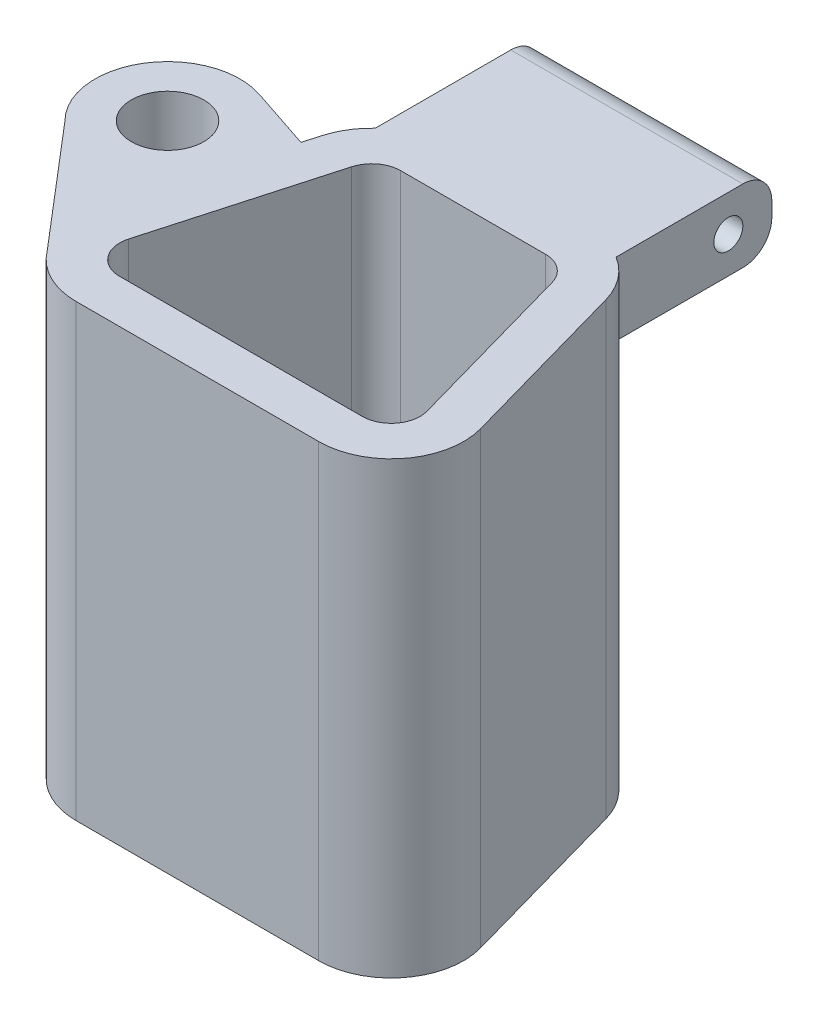
ISO-10303-21;
HEADER;
FILE_DESCRIPTION(('STEP AP214'),'2;1');
FILE_NAME('part.step','',(''),(''),'','','');
FILE_SCHEMA(('AUTOMOTIVE_DESIGN { 1 0 10303 214 1 1 1 1 }'));
ENDSEC;
DATA;
#1=APPLICATION_CONTEXT('core data for automotive mechanical design processes');
#2=APPLICATION_PROTOCOL_DEFINITION('international standard','automotive_design',2000,#1);
#3=PRODUCT_CONTEXT('',#1,'mechanical');
#4=PRODUCT('Part','Part','',(#3));
#5=PRODUCT_RELATED_PRODUCT_CATEGORY('part','',(#4));
#6=PRODUCT_DEFINITION_FORMATION('','',#4);
#7=PRODUCT_DEFINITION_CONTEXT('part definition',#1,'design');
#8=PRODUCT_DEFINITION('design','',#6,#7);
#9=PRODUCT_DEFINITION_SHAPE('','',#8);
#10=(LENGTH_UNIT() NAMED_UNIT(*) SI_UNIT(.MILLI.,.METRE.));
#11=(NAMED_UNIT(*) PLANE_ANGLE_UNIT() SI_UNIT($,.RADIAN.));
#12=(NAMED_UNIT(*) SI_UNIT($,.STERADIAN.) SOLID_ANGLE_UNIT());
#13=UNCERTAINTY_MEASURE_WITH_UNIT(LENGTH_MEASURE(1.E-05),#10,'distance_accuracy_value','');
#14=(GEOMETRIC_REPRESENTATION_CONTEXT(3) GLOBAL_UNCERTAINTY_ASSIGNED_CONTEXT((#13)) GLOBAL_UNIT_ASSIGNED_CONTEXT((#10,
#11,#12)) REPRESENTATION_CONTEXT('',''));
#15=CARTESIAN_POINT('',(0.,0.,0.));
#16=DIRECTION('',(0.,0.,1.));
#17=DIRECTION('',(1.,0.,0.));
#18=AXIS2_PLACEMENT_3D('',#15,#16,#17);
#19=CARTESIAN_POINT('',(0.,0.,-21.));
#20=DIRECTION('',(0.,0.,1.));
#21=DIRECTION('',(1.,0.,0.));
#22=AXIS2_PLACEMENT_3D('',#19,#20,#21);
#23=PLANE('',#22);
#24=DIRECTION('',(1.,0.,0.));
#25=VECTOR('',#24,1.);
#26=CARTESIAN_POINT('',(0.,28.,-21.));
#27=LINE('',#26,#25);
#28=CARTESIAN_POINT('',(-8.39857367676646,28.,-21.));
#29=VERTEX_POINT('',#28);
#30=CARTESIAN_POINT('',(7.60142632323355,28.,-21.));
#31=VERTEX_POINT('',#30);
#32=EDGE_CURVE('E357',#29,#31,#27,.T.);
#33=ORIENTED_EDGE('',*,*,#32,.F.);
#34=DIRECTION('',(0.,1.,0.));
#35=VECTOR('',#34,1.);
#36=CARTESIAN_POINT('',(-8.39857367676646,26.,-21.));
#37=LINE('',#36,#35);
#38=CARTESIAN_POINT('',(-8.39857367676646,29.,-21.));
#39=VERTEX_POINT('',#38);
#40=EDGE_CURVE('E328',#39,#29,#37,.F.);
#41=ORIENTED_EDGE('',*,*,#40,.F.);
#42=DIRECTION('',(1.,0.,0.));
#43=VECTOR('',#42,1.);
#44=CARTESIAN_POINT('',(0.,29.,-21.));
#45=LINE('',#44,#43);
#46=CARTESIAN_POINT('',(7.60142632323355,29.,-21.));
#47=VERTEX_POINT('',#46);
#48=EDGE_CURVE('E319',#47,#39,#45,.F.);
#49=ORIENTED_EDGE('',*,*,#48,.F.);
#50=DIRECTION('',(0.,1.,0.));
#51=VECTOR('',#50,1.);
#52=CARTESIAN_POINT('',(7.60142632323355,0.,-21.));
#53=LINE('',#52,#51);
#54=EDGE_CURVE('E361',#31,#47,#53,.T.);
#55=ORIENTED_EDGE('',*,*,#54,.F.);
#56=EDGE_LOOP('',(#33,#41,#49,#55));
#57=FACE_BOUND('',#56,.T.);
#58=ADVANCED_FACE('F17',(#57),#23,.F.);
#59=CARTESIAN_POINT('',(13.3599037326757,28.5,-18.));
#60=DIRECTION('',(-1.,0.,0.));
#61=DIRECTION('',(0.,0.,1.));
#62=AXIS2_PLACEMENT_3D('',#59,#60,#61);
#63=CYLINDRICAL_SURFACE('',#62,1.);
#64=CARTESIAN_POINT('',(7.60142632323355,28.5,-18.));
#65=DIRECTION('',(-1.,0.,0.));
#66=DIRECTION('',(0.,0.,1.));
#67=AXIS2_PLACEMENT_3D('',#64,#65,#66);
#68=CIRCLE('',#67,1.);
#69=CARTESIAN_POINT('',(7.60142632323355,28.5,-17.));
#70=VERTEX_POINT('',#69);
#71=EDGE_CURVE('E316',#70,#70,#68,.T.);
#72=ORIENTED_EDGE('',*,*,#71,.F.);
#73=EDGE_LOOP('',(#72));
#74=FACE_BOUND('',#73,.T.);
#75=CARTESIAN_POINT('',(-8.39857367676645,28.5,-18.));
#76=DIRECTION('',(-1.,0.,0.));
#77=DIRECTION('',(0.,0.,1.));
#78=AXIS2_PLACEMENT_3D('',#75,#76,#77);
#79=CIRCLE('',#78,1.);
#80=CARTESIAN_POINT('',(-8.39857367676645,28.5,-17.));
#81=VERTEX_POINT('',#80);
#82=EDGE_CURVE('E329',#81,#81,#79,.F.);
#83=ORIENTED_EDGE('',*,*,#82,.F.);
#84=EDGE_LOOP('',(#83));
#85=FACE_BOUND('',#84,.T.);
#86=ADVANCED_FACE('F570',(#74,#85),#63,.F.);
#87=CARTESIAN_POINT('',(0.,28.,-19.));
#88=DIRECTION('',(1.,0.,0.));
#89=DIRECTION('',(0.,0.,-1.));
#90=AXIS2_PLACEMENT_3D('',#87,#88,#89);
#91=CYLINDRICAL_SURFACE('',#90,2.);
#92=CARTESIAN_POINT('',(-8.39857367676646,28.,-19.));
#93=DIRECTION('',(1.,0.,0.));
#94=DIRECTION('',(0.,0.,-1.));
#95=AXIS2_PLACEMENT_3D('',#92,#93,#94);
#96=CIRCLE('',#95,2.);
#97=CARTESIAN_POINT('',(-8.39857367676646,26.,-19.));
#98=VERTEX_POINT('',#97);
#99=EDGE_CURVE('E324',#29,#98,#96,.F.);
#100=ORIENTED_EDGE('',*,*,#99,.F.);
#101=ORIENTED_EDGE('',*,*,#32,.T.);
#102=CARTESIAN_POINT('',(7.60142632323355,28.,-19.));
#103=DIRECTION('',(1.,0.,0.));
#104=DIRECTION('',(0.,0.,-1.));
#105=AXIS2_PLACEMENT_3D('',#102,#103,#104);
#106=CIRCLE('',#105,2.);
#107=CARTESIAN_POINT('',(7.60142632323355,26.,-19.));
#108=VERTEX_POINT('',#107);
#109=EDGE_CURVE('E312',#108,#31,#106,.T.);
#110=ORIENTED_EDGE('',*,*,#109,.F.);
#111=DIRECTION('',(1.,0.,0.));
#112=VECTOR('',#111,1.);
#113=CARTESIAN_POINT('',(7.60142632323355,26.,-19.));
#114=LINE('',#113,#112);
#115=EDGE_CURVE('E360',#98,#108,#114,.T.);
#116=ORIENTED_EDGE('',*,*,#115,.F.);
#117=EDGE_LOOP('',(#100,#101,#110,#116));
#118=FACE_BOUND('',#117,.T.);
#119=ADVANCED_FACE('F568',(#118),#91,.T.);
#120=CARTESIAN_POINT('',(7.60142632323355,26.,8.76305461424021));
#121=DIRECTION('',(0.,-1.,0.));
#122=DIRECTION('',(0.,0.,-1.));
#123=AXIS2_PLACEMENT_3D('',#120,#121,#122);
#124=PLANE('',#123);
#125=DIRECTION('',(1.,0.,0.));
#126=VECTOR('',#125,1.);
#127=CARTESIAN_POINT('',(-4.98490373267567,26.,-11.));
#128=LINE('',#127,#126);
#129=CARTESIAN_POINT('',(4.98490373267567,26.,-11.));
#130=VERTEX_POINT('',#129);
#131=CARTESIAN_POINT('',(-4.98490373267567,26.,-11.));
#132=VERTEX_POINT('',#131);
#133=EDGE_CURVE('E340',#130,#132,#128,.F.);
#134=ORIENTED_EDGE('',*,*,#133,.T.);
#135=CARTESIAN_POINT('',(-4.98490373267567,26.,-6.));
#136=DIRECTION('',(0.,-1.,0.));
#137=DIRECTION('',(0.,0.,-1.));
#138=AXIS2_PLACEMENT_3D('',#135,#136,#137);
#139=CIRCLE('',#138,5.);
#140=CARTESIAN_POINT('',(-8.39857367676646,26.,-9.65333512188674));
#141=VERTEX_POINT('',#140);
#142=EDGE_CURVE('E333',#141,#132,#139,.T.);
#143=ORIENTED_EDGE('',*,*,#142,.F.);
#144=DIRECTION('',(0.,0.,1.));
#145=VECTOR('',#144,1.);
#146=CARTESIAN_POINT('',(-8.39857367676646,26.,8.76305461424021));
#147=LINE('',#146,#145);
#148=EDGE_CURVE('E327',#98,#141,#147,.T.);
#149=ORIENTED_EDGE('',*,*,#148,.F.);
#150=ORIENTED_EDGE('',*,*,#115,.T.);
#151=DIRECTION('',(0.,0.,-1.));
#152=VECTOR('',#151,1.);
#153=CARTESIAN_POINT('',(7.60142632323355,26.,8.76305461424021));
#154=LINE('',#153,#152);
#155=CARTESIAN_POINT('',(7.60142632323355,26.,-10.260728756105));
#156=VERTEX_POINT('',#155);
#157=EDGE_CURVE('E315',#156,#108,#154,.T.);
#158=ORIENTED_EDGE('',*,*,#157,.F.);
#159=CARTESIAN_POINT('',(4.98490373267567,26.,-6.));
#160=DIRECTION('',(0.,-1.,0.));
#161=DIRECTION('',(0.,0.,-1.));
#162=AXIS2_PLACEMENT_3D('',#159,#160,#161);
#163=CIRCLE('',#162,5.);
#164=EDGE_CURVE('E305',#130,#156,#163,.T.);
#165=ORIENTED_EDGE('',*,*,#164,.F.);
#166=EDGE_LOOP('',(#134,#143,#149,#150,#158,#165));
#167=FACE_BOUND('',#166,.T.);
#168=ADVANCED_FACE('F566',(#167),#124,.T.);
#169=CARTESIAN_POINT('',(-9.79815843344516,31.,-7.35372788459142));
#170=DIRECTION('',(0.962650940153899,0.,0.270745576918284));
#171=DIRECTION('',(0.270745576918284,0.,-0.962650940153899));
#172=AXIS2_PLACEMENT_3D('',#169,#170,#171);
#173=PLANE('',#172);
#174=DIRECTION('',(0.,1.,0.));
#175=VECTOR('',#174,1.);
#176=CARTESIAN_POINT('',(-10.1091899581308,0.,-6.2478380190423));
#177=LINE('',#176,#175);
#178=CARTESIAN_POINT('',(-10.1091899581308,31.,-6.2478380190423));
#179=VERTEX_POINT('',#178);
#180=CARTESIAN_POINT('',(-10.1091899581308,0.,-6.2478380190423));
#181=VERTEX_POINT('',#180);
#182=EDGE_CURVE('E407',#179,#181,#177,.F.);
#183=ORIENTED_EDGE('',*,*,#182,.F.);
#184=DIRECTION('',(0.270745576918284,0.,-0.962650940153899));
#185=VECTOR('',#184,1.);
#186=CARTESIAN_POINT('',(-9.79815843344516,31.,-7.35372788459142));
#187=LINE('',#186,#185);
#188=CARTESIAN_POINT('',(-9.79815843344516,31.,-7.35372788459142));
#189=VERTEX_POINT('',#188);
#190=EDGE_CURVE('E362',#189,#179,#187,.F.);
#191=ORIENTED_EDGE('',*,*,#190,.F.);
#192=DIRECTION('',(0.,-1.,0.));
#193=VECTOR('',#192,1.);
#194=CARTESIAN_POINT('',(-9.79815843344516,31.,-7.35372788459142));
#195=LINE('',#194,#193);
#196=CARTESIAN_POINT('',(-9.79815843344516,0.,-7.35372788459142));
#197=VERTEX_POINT('',#196);
#198=EDGE_CURVE('E332',#197,#189,#195,.F.);
#199=ORIENTED_EDGE('',*,*,#198,.F.);
#200=DIRECTION('',(0.270745576918284,0.,-0.962650940153899));
#201=VECTOR('',#200,1.);
#202=CARTESIAN_POINT('',(-9.79815843344516,0.,-7.35372788459142));
#203=LINE('',#202,#201);
#204=EDGE_CURVE('E420',#181,#197,#203,.T.);
#205=ORIENTED_EDGE('',*,*,#204,.F.);
#206=EDGE_LOOP('',(#183,#191,#199,#205));
#207=FACE_BOUND('',#206,.T.);
#208=ADVANCED_FACE('F538',(#207),#173,.F.);
#209=CARTESIAN_POINT('',(-34.4188702996613,6.75,6.53338760482129));
#210=DIRECTION('',(0.,-1.,0.));
#211=DIRECTION('',(0.,0.,-1.));
#212=AXIS2_PLACEMENT_3D('',#209,#210,#211);
#213=PLANE('',#212);
#214=CARTESIAN_POINT('',(-16.,6.75,-2.93894053226755));
#215=DIRECTION('',(0.,1.,0.));
#216=DIRECTION('',(0.,0.,1.));
#217=AXIS2_PLACEMENT_3D('',#214,#215,#216);
#218=CIRCLE('',#217,2.5);
#219=CARTESIAN_POINT('',(-16.,6.75,-0.438940532267547));
#220=VERTEX_POINT('',#219);
#221=EDGE_CURVE('E337',#220,#220,#218,.F.);
#222=ORIENTED_EDGE('',*,*,#221,.T.);
#223=EDGE_LOOP('',(#222));
#224=FACE_BOUND('',#223,.T.);
#225=DIRECTION('',(0.649266068214155,0.,0.760561353649876));
#226=VECTOR('',#225,1.);
#227=CARTESIAN_POINT('',(-19.5355339059327,6.75,0.596593373665191));
#228=LINE('',#227,#226);
#229=CARTESIAN_POINT('',(-14.4379912957076,6.75,6.5679417895537));
#230=VERTEX_POINT('',#229);
#231=CARTESIAN_POINT('',(-19.5355339059327,6.75,0.59659337366519));
#232=VERTEX_POINT('',#231);
#233=EDGE_CURVE('E410',#230,#232,#228,.F.);
#234=ORIENTED_EDGE('',*,*,#233,.F.);
#235=DIRECTION('',(0.315824000920269,0.,-0.948817790960263));
#236=VECTOR('',#235,1.);
#237=CARTESIAN_POINT('',(-16.4206255796037,6.75,12.5242930359661));
#238=LINE('',#237,#236);
#239=CARTESIAN_POINT('',(-10.1658465901712,6.75,-6.26669677609779));
#240=VERTEX_POINT('',#239);
#241=EDGE_CURVE('E197',#230,#240,#238,.T.);
#242=ORIENTED_EDGE('',*,*,#241,.T.);
#243=DIRECTION('',(-0.948817790960263,0.,-0.315824000920269));
#244=VECTOR('',#243,1.);
#245=CARTESIAN_POINT('',(-14.4208799953987,6.75,-7.68302948706886));
#246=LINE('',#245,#244);
#247=CARTESIAN_POINT('',(-14.4208799953987,6.75,-7.68302948706886));
#248=VERTEX_POINT('',#247);
#249=EDGE_CURVE('E406',#248,#240,#246,.F.);
#250=ORIENTED_EDGE('',*,*,#249,.F.);
#251=CARTESIAN_POINT('',(-16.,6.75,-2.93894053226755));
#252=DIRECTION('',(0.,1.,0.));
#253=DIRECTION('',(0.,0.,1.));
#254=AXIS2_PLACEMENT_3D('',#251,#252,#253);
#255=CIRCLE('',#254,5.);
#256=EDGE_CURVE('E20',#232,#248,#255,.F.);
#257=ORIENTED_EDGE('',*,*,#256,.F.);
#258=EDGE_LOOP('',(#234,#242,#250,#257));
#259=FACE_BOUND('',#258,.T.);
#260=ADVANCED_FACE('F463',(#224,#259),#213,.F.);
#261=CARTESIAN_POINT('',(-16.4206255796037,6.75,12.5242930359661));
#262=DIRECTION('',(0.948817790960263,0.,0.315824000920269));
#263=DIRECTION('',(0.315824000920269,0.,-0.948817790960263));
#264=AXIS2_PLACEMENT_3D('',#261,#262,#263);
#265=PLANE('',#264);
#266=DIRECTION('',(0.315824000920269,0.,-0.948817790960263));
#267=VECTOR('',#266,1.);
#268=CARTESIAN_POINT('',(-14.4379912957076,24.25,6.5679417895537));
#269=LINE('',#268,#267);
#270=CARTESIAN_POINT('',(-14.4379912957076,24.25,6.5679417895537));
#271=VERTEX_POINT('',#270);
#272=CARTESIAN_POINT('',(-10.1658465901712,24.25,-6.26669677609779));
#273=VERTEX_POINT('',#272);
#274=EDGE_CURVE('E350',#271,#273,#269,.T.);
#275=ORIENTED_EDGE('',*,*,#274,.T.);
#276=DIRECTION('',(0.,1.,0.));
#277=VECTOR('',#276,1.);
#278=CARTESIAN_POINT('',(-10.1658465901712,0.,-6.26669677609779));
#279=LINE('',#278,#277);
#280=EDGE_CURVE('E299',#240,#273,#279,.T.);
#281=ORIENTED_EDGE('',*,*,#280,.F.);
#282=ORIENTED_EDGE('',*,*,#241,.F.);
#283=DIRECTION('',(0.,1.,0.));
#284=VECTOR('',#283,1.);
#285=CARTESIAN_POINT('',(-14.4379912957076,0.,6.5679417895537));
#286=LINE('',#285,#284);
#287=EDGE_CURVE('E442',#271,#230,#286,.F.);
#288=ORIENTED_EDGE('',*,*,#287,.F.);
#289=EDGE_LOOP('',(#275,#281,#282,#288));
#290=FACE_BOUND('',#289,.T.);
#291=ADVANCED_FACE('F453',(#290),#265,.F.);
#292=CARTESIAN_POINT('',(-34.4188702996613,24.25,6.53338760482129));
#293=DIRECTION('',(0.,1.,0.));
#294=DIRECTION('',(0.,0.,1.));
#295=AXIS2_PLACEMENT_3D('',#292,#293,#294);
#296=PLANE('',#295);
#297=CARTESIAN_POINT('',(-16.,24.25,-2.93894053226755));
#298=DIRECTION('',(0.,1.,0.));
#299=DIRECTION('',(0.,0.,1.));
#300=AXIS2_PLACEMENT_3D('',#297,#298,#299);
#301=CIRCLE('',#300,2.5);
#302=CARTESIAN_POINT('',(-16.,24.25,-0.438940532267547));
#303=VERTEX_POINT('',#302);
#304=EDGE_CURVE('E296',#303,#303,#301,.T.);
#305=ORIENTED_EDGE('',*,*,#304,.T.);
#306=EDGE_LOOP('',(#305));
#307=FACE_BOUND('',#306,.T.);
#308=DIRECTION('',(-0.948817790960263,0.,-0.315824000920269));
#309=VECTOR('',#308,1.);
#310=CARTESIAN_POINT('',(-14.4208799953987,24.25,-7.68302948706886));
#311=LINE('',#310,#309);
#312=CARTESIAN_POINT('',(-14.4208799953987,24.25,-7.68302948706886));
#313=VERTEX_POINT('',#312);
#314=EDGE_CURVE('E429',#273,#313,#311,.T.);
#315=ORIENTED_EDGE('',*,*,#314,.F.);
#316=ORIENTED_EDGE('',*,*,#274,.F.);
#317=DIRECTION('',(0.649266068214155,0.,0.760561353649876));
#318=VECTOR('',#317,1.);
#319=CARTESIAN_POINT('',(-19.5355339059327,24.25,0.596593373665191));
#320=LINE('',#319,#318);
#321=CARTESIAN_POINT('',(-19.5355339059327,24.25,0.59659337366519));
#322=VERTEX_POINT('',#321);
#323=EDGE_CURVE('E439',#322,#271,#320,.T.);
#324=ORIENTED_EDGE('',*,*,#323,.F.);
#325=CARTESIAN_POINT('',(-16.,24.25,-2.93894053226755));
#326=DIRECTION('',(0.,1.,0.));
#327=DIRECTION('',(0.,0.,1.));
#328=AXIS2_PLACEMENT_3D('',#325,#326,#327);
#329=CIRCLE('',#328,5.);
#330=EDGE_CURVE('E300',#313,#322,#329,.T.);
#331=ORIENTED_EDGE('',*,*,#330,.F.);
#332=EDGE_LOOP('',(#315,#316,#324,#331));
#333=FACE_BOUND('',#332,.T.);
#334=ADVANCED_FACE('F457',(#307,#333),#296,.F.);
#335=CARTESIAN_POINT('',(-16.,0.,-2.93894053226755));
#336=DIRECTION('',(0.,1.,0.));
#337=DIRECTION('',(0.,0.,1.));
#338=AXIS2_PLACEMENT_3D('',#335,#336,#337);
#339=CYLINDRICAL_SURFACE('',#338,5.);
#340=CARTESIAN_POINT('',(-16.,0.,-2.93894053226755));
#341=DIRECTION('',(0.,1.,0.));
#342=DIRECTION('',(0.,0.,1.));
#343=AXIS2_PLACEMENT_3D('',#340,#341,#342);
#344=CIRCLE('',#343,5.);
#345=CARTESIAN_POINT('',(-19.5355339059327,0.,0.596593373665186));
#346=VERTEX_POINT('',#345);
#347=CARTESIAN_POINT('',(-14.4208799953987,0.,-7.68302948706886));
#348=VERTEX_POINT('',#347);
#349=EDGE_CURVE('E288',#346,#348,#344,.F.);
#350=ORIENTED_EDGE('',*,*,#349,.F.);
#351=DIRECTION('',(0.,1.,0.));
#352=VECTOR('',#351,1.);
#353=CARTESIAN_POINT('',(-19.5355339059327,0.,0.596593373665191));
#354=LINE('',#353,#352);
#355=EDGE_CURVE('E408',#232,#346,#354,.F.);
#356=ORIENTED_EDGE('',*,*,#355,.F.);
#357=ORIENTED_EDGE('',*,*,#256,.T.);
#358=DIRECTION('',(0.,1.,0.));
#359=VECTOR('',#358,1.);
#360=CARTESIAN_POINT('',(-14.4208799953987,0.,-7.68302948706886));
#361=LINE('',#360,#359);
#362=EDGE_CURVE('E403',#348,#248,#361,.T.);
#363=ORIENTED_EDGE('',*,*,#362,.F.);
#364=EDGE_LOOP('',(#350,#356,#357,#363));
#365=FACE_BOUND('',#364,.T.);
#366=ADVANCED_FACE('F466',(#365),#339,.T.);
#367=CARTESIAN_POINT('',(-4.98490373267567,31.,-11.));
#368=DIRECTION('',(0.,0.,1.));
#369=DIRECTION('',(1.,0.,0.));
#370=AXIS2_PLACEMENT_3D('',#367,#368,#369);
#371=PLANE('',#370);
#372=ORIENTED_EDGE('',*,*,#133,.F.);
#373=DIRECTION('',(0.,-1.,0.));
#374=VECTOR('',#373,1.);
#375=CARTESIAN_POINT('',(4.98490373267567,31.,-11.));
#376=LINE('',#375,#374);
#377=CARTESIAN_POINT('',(4.98490373267567,0.,-11.));
#378=VERTEX_POINT('',#377);
#379=EDGE_CURVE('E398',#378,#130,#376,.F.);
#380=ORIENTED_EDGE('',*,*,#379,.F.);
#381=DIRECTION('',(1.,0.,0.));
#382=VECTOR('',#381,1.);
#383=CARTESIAN_POINT('',(-8.35990373267567,0.,-11.));
#384=LINE('',#383,#382);
#385=CARTESIAN_POINT('',(-4.98490373267567,0.,-11.));
#386=VERTEX_POINT('',#385);
#387=EDGE_CURVE('E283',#386,#378,#384,.T.);
#388=ORIENTED_EDGE('',*,*,#387,.F.);
#389=DIRECTION('',(0.,-1.,0.));
#390=VECTOR('',#389,1.);
#391=CARTESIAN_POINT('',(-4.98490373267567,31.,-11.));
#392=LINE('',#391,#390);
#393=EDGE_CURVE('E335',#132,#386,#392,.T.);
#394=ORIENTED_EDGE('',*,*,#393,.F.);
#395=EDGE_LOOP('',(#372,#380,#388,#394));
#396=FACE_BOUND('',#395,.T.);
#397=ADVANCED_FACE('F545',(#396),#371,.F.);
#398=CARTESIAN_POINT('',(-16.,0.,-2.93894053226755));
#399=DIRECTION('',(0.,1.,0.));
#400=DIRECTION('',(0.,0.,1.));
#401=AXIS2_PLACEMENT_3D('',#398,#399,#400);
#402=CYLINDRICAL_SURFACE('',#401,2.5);
#403=ORIENTED_EDGE('',*,*,#221,.F.);
#404=EDGE_LOOP('',(#403));
#405=FACE_BOUND('',#404,.T.);
#406=CARTESIAN_POINT('',(-16.,0.,-2.93894053226755));
#407=DIRECTION('',(0.,1.,0.));
#408=DIRECTION('',(0.,0.,1.));
#409=AXIS2_PLACEMENT_3D('',#406,#407,#408);
#410=CIRCLE('',#409,2.5);
#411=CARTESIAN_POINT('',(-16.,0.,-0.438940532267547));
#412=VERTEX_POINT('',#411);
#413=EDGE_CURVE('E264',#412,#412,#410,.T.);
#414=ORIENTED_EDGE('',*,*,#413,.F.);
#415=EDGE_LOOP('',(#414));
#416=FACE_BOUND('',#415,.T.);
#417=ADVANCED_FACE('F643',(#405,#416),#402,.F.);
#418=CARTESIAN_POINT('',(-4.98490373267567,31.,-6.));
#419=DIRECTION('',(0.,-1.,0.));
#420=DIRECTION('',(0.,0.,-1.));
#421=AXIS2_PLACEMENT_3D('',#418,#419,#420);
#422=CYLINDRICAL_SURFACE('',#421,2.);
#423=DIRECTION('',(0.,1.,0.));
#424=VECTOR('',#423,1.);
#425=CARTESIAN_POINT('',(-4.98490373267567,31.,-8.));
#426=LINE('',#425,#424);
#427=CARTESIAN_POINT('',(-4.98490373267567,31.,-8.));
#428=VERTEX_POINT('',#427);
#429=CARTESIAN_POINT('',(-4.98490373267567,0.,-8.));
#430=VERTEX_POINT('',#429);
#431=EDGE_CURVE('E336',#428,#430,#426,.F.);
#432=ORIENTED_EDGE('',*,*,#431,.F.);
#433=CARTESIAN_POINT('',(-4.98490373267567,31.,-6.));
#434=DIRECTION('',(0.,-1.,0.));
#435=DIRECTION('',(0.,0.,-1.));
#436=AXIS2_PLACEMENT_3D('',#433,#434,#435);
#437=CIRCLE('',#436,2.);
#438=CARTESIAN_POINT('',(-6.91020561298346,31.,-6.54149115383657));
#439=VERTEX_POINT('',#438);
#440=EDGE_CURVE('E259',#428,#439,#437,.F.);
#441=ORIENTED_EDGE('',*,*,#440,.T.);
#442=DIRECTION('',(0.,1.,0.));
#443=VECTOR('',#442,1.);
#444=CARTESIAN_POINT('',(-6.91020561298346,31.,-6.54149115383657));
#445=LINE('',#444,#443);
#446=CARTESIAN_POINT('',(-6.91020561298346,0.,-6.54149115383657));
#447=VERTEX_POINT('',#446);
#448=EDGE_CURVE('E339',#447,#439,#445,.T.);
#449=ORIENTED_EDGE('',*,*,#448,.F.);
#450=CARTESIAN_POINT('',(-4.98490373267567,0.,-6.));
#451=DIRECTION('',(0.,-1.,0.));
#452=DIRECTION('',(0.,0.,-1.));
#453=AXIS2_PLACEMENT_3D('',#450,#451,#452);
#454=CIRCLE('',#453,2.);
#455=EDGE_CURVE('E268',#430,#447,#454,.F.);
#456=ORIENTED_EDGE('',*,*,#455,.F.);
#457=EDGE_LOOP('',(#432,#441,#449,#456));
#458=FACE_BOUND('',#457,.T.);
#459=ADVANCED_FACE('F639',(#458),#422,.F.);
#460=CARTESIAN_POINT('',(-6.91020561298346,31.,-6.54149115383657));
#461=DIRECTION('',(0.962650940153899,0.,0.270745576918284));
#462=DIRECTION('',(0.270745576918284,0.,-0.962650940153899));
#463=AXIS2_PLACEMENT_3D('',#460,#461,#462);
#464=PLANE('',#463);
#465=DIRECTION('',(-0.270745576918284,0.,0.962650940153899));
#466=VECTOR('',#465,1.);
#467=CARTESIAN_POINT('',(-6.91020561298346,31.,-6.54149115383657));
#468=LINE('',#467,#466);
#469=CARTESIAN_POINT('',(-10.2852056129835,31.,5.45850884616343));
#470=VERTEX_POINT('',#469);
#471=EDGE_CURVE('E258',#439,#470,#468,.T.);
#472=ORIENTED_EDGE('',*,*,#471,.T.);
#473=DIRECTION('',(0.,-1.,0.));
#474=VECTOR('',#473,1.);
#475=CARTESIAN_POINT('',(-10.2852056129835,31.,5.45850884616343));
#476=LINE('',#475,#474);
#477=CARTESIAN_POINT('',(-10.2852056129835,0.,5.45850884616343));
#478=VERTEX_POINT('',#477);
#479=EDGE_CURVE('E263',#470,#478,#476,.T.);
#480=ORIENTED_EDGE('',*,*,#479,.T.);
#481=DIRECTION('',(-0.270745576918284,0.,0.962650940153899));
#482=VECTOR('',#481,1.);
#483=CARTESIAN_POINT('',(-6.91020561298346,0.,-6.54149115383657));
#484=LINE('',#483,#482);
#485=EDGE_CURVE('E267',#447,#478,#484,.T.);
#486=ORIENTED_EDGE('',*,*,#485,.F.);
#487=ORIENTED_EDGE('',*,*,#448,.T.);
#488=EDGE_LOOP('',(#472,#480,#486,#487));
#489=FACE_BOUND('',#488,.T.);
#490=ADVANCED_FACE('F635',(#489),#464,.T.);
#491=CARTESIAN_POINT('',(4.98490373267567,31.,-6.));
#492=DIRECTION('',(0.,-1.,0.));
#493=DIRECTION('',(0.,0.,-1.));
#494=AXIS2_PLACEMENT_3D('',#491,#492,#493);
#495=CYLINDRICAL_SURFACE('',#494,2.);
#496=DIRECTION('',(0.,1.,0.));
#497=VECTOR('',#496,1.);
#498=CARTESIAN_POINT('',(6.91020561298346,31.,-6.54149115383657));
#499=LINE('',#498,#497);
#500=CARTESIAN_POINT('',(6.91020561298346,31.,-6.54149115383657));
#501=VERTEX_POINT('',#500);
#502=CARTESIAN_POINT('',(6.91020561298346,0.,-6.54149115383657));
#503=VERTEX_POINT('',#502);
#504=EDGE_CURVE('E295',#501,#503,#499,.F.);
#505=ORIENTED_EDGE('',*,*,#504,.F.);
#506=CARTESIAN_POINT('',(4.98490373267567,31.,-6.));
#507=DIRECTION('',(0.,-1.,0.));
#508=DIRECTION('',(0.,0.,-1.));
#509=AXIS2_PLACEMENT_3D('',#506,#507,#508);
#510=CIRCLE('',#509,2.);
#511=CARTESIAN_POINT('',(4.98490373267567,31.,-8.));
#512=VERTEX_POINT('',#511);
#513=EDGE_CURVE('E226',#501,#512,#510,.F.);
#514=ORIENTED_EDGE('',*,*,#513,.T.);
#515=DIRECTION('',(0.,1.,0.));
#516=VECTOR('',#515,1.);
#517=CARTESIAN_POINT('',(4.98490373267567,31.,-8.));
#518=LINE('',#517,#516);
#519=CARTESIAN_POINT('',(4.98490373267567,0.,-8.));
#520=VERTEX_POINT('',#519);
#521=EDGE_CURVE('E344',#520,#512,#518,.T.);
#522=ORIENTED_EDGE('',*,*,#521,.F.);
#523=CARTESIAN_POINT('',(4.98490373267567,0.,-6.));
#524=DIRECTION('',(0.,-1.,0.));
#525=DIRECTION('',(0.,0.,-1.));
#526=AXIS2_PLACEMENT_3D('',#523,#524,#525);
#527=CIRCLE('',#526,2.);
#528=EDGE_CURVE('E272',#503,#520,#527,.F.);
#529=ORIENTED_EDGE('',*,*,#528,.F.);
#530=EDGE_LOOP('',(#505,#514,#522,#529));
#531=FACE_BOUND('',#530,.T.);
#532=ADVANCED_FACE('F631',(#531),#495,.F.);
#533=CARTESIAN_POINT('',(-4.98490373267567,31.,-8.));
#534=DIRECTION('',(0.,0.,1.));
#535=DIRECTION('',(1.,0.,0.));
#536=AXIS2_PLACEMENT_3D('',#533,#534,#535);
#537=PLANE('',#536);
#538=DIRECTION('',(1.,0.,0.));
#539=VECTOR('',#538,1.);
#540=CARTESIAN_POINT('',(-8.35990373267567,31.,-8.));
#541=LINE('',#540,#539);
#542=EDGE_CURVE('E255',#512,#428,#541,.F.);
#543=ORIENTED_EDGE('',*,*,#542,.T.);
#544=ORIENTED_EDGE('',*,*,#431,.T.);
#545=DIRECTION('',(1.,0.,0.));
#546=VECTOR('',#545,1.);
#547=CARTESIAN_POINT('',(-8.35990373267567,0.,-8.));
#548=LINE('',#547,#546);
#549=EDGE_CURVE('E271',#520,#430,#548,.F.);
#550=ORIENTED_EDGE('',*,*,#549,.F.);
#551=ORIENTED_EDGE('',*,*,#521,.T.);
#552=EDGE_LOOP('',(#543,#544,#550,#551));
#553=FACE_BOUND('',#552,.T.);
#554=ADVANCED_FACE('F628',(#553),#537,.T.);
#555=CARTESIAN_POINT('',(-4.98490373267567,31.,-6.));
#556=DIRECTION('',(0.,-1.,0.));
#557=DIRECTION('',(0.,0.,-1.));
#558=AXIS2_PLACEMENT_3D('',#555,#556,#557);
#559=CYLINDRICAL_SURFACE('',#558,5.);
#560=ORIENTED_EDGE('',*,*,#198,.T.);
#561=CARTESIAN_POINT('',(-4.98490373267567,31.,-6.));
#562=DIRECTION('',(0.,-1.,0.));
#563=DIRECTION('',(0.,0.,-1.));
#564=AXIS2_PLACEMENT_3D('',#561,#562,#563);
#565=CIRCLE('',#564,5.);
#566=CARTESIAN_POINT('',(-8.39857367676646,31.,-9.65333512188674));
#567=VERTEX_POINT('',#566);
#568=EDGE_CURVE('E252',#189,#567,#565,.T.);
#569=ORIENTED_EDGE('',*,*,#568,.T.);
#570=DIRECTION('',(0.,1.,0.));
#571=VECTOR('',#570,1.);
#572=CARTESIAN_POINT('',(-8.39857367676646,26.,-9.65333512188674));
#573=LINE('',#572,#571);
#574=EDGE_CURVE('E323',#141,#567,#573,.T.);
#575=ORIENTED_EDGE('',*,*,#574,.F.);
#576=ORIENTED_EDGE('',*,*,#142,.T.);
#577=ORIENTED_EDGE('',*,*,#393,.T.);
#578=CARTESIAN_POINT('',(-4.98490373267567,0.,-6.));
#579=DIRECTION('',(0.,-1.,0.));
#580=DIRECTION('',(0.,0.,-1.));
#581=AXIS2_PLACEMENT_3D('',#578,#579,#580);
#582=CIRCLE('',#581,5.);
#583=EDGE_CURVE('E284',#197,#386,#582,.T.);
#584=ORIENTED_EDGE('',*,*,#583,.F.);
#585=EDGE_LOOP('',(#560,#569,#575,#576,#577,#584));
#586=FACE_BOUND('',#585,.T.);
#587=ADVANCED_FACE('F541',(#586),#559,.T.);
#588=CARTESIAN_POINT('',(-8.39857367676646,26.,8.76305461424021));
#589=DIRECTION('',(-1.,0.,0.));
#590=DIRECTION('',(0.,0.,1.));
#591=AXIS2_PLACEMENT_3D('',#588,#589,#590);
#592=PLANE('',#591);
#593=DIRECTION('',(0.,0.,-1.));
#594=VECTOR('',#593,1.);
#595=CARTESIAN_POINT('',(-8.39857367676646,31.,6.));
#596=LINE('',#595,#594);
#597=CARTESIAN_POINT('',(-8.39857367676646,31.,-19.));
#598=VERTEX_POINT('',#597);
#599=EDGE_CURVE('E254',#567,#598,#596,.T.);
#600=ORIENTED_EDGE('',*,*,#599,.T.);
#601=CARTESIAN_POINT('',(-8.39857367676646,29.,-19.));
#602=DIRECTION('',(1.,0.,0.));
#603=DIRECTION('',(0.,0.,-1.));
#604=AXIS2_PLACEMENT_3D('',#601,#602,#603);
#605=CIRCLE('',#604,2.);
#606=EDGE_CURVE('E320',#39,#598,#605,.T.);
#607=ORIENTED_EDGE('',*,*,#606,.F.);
#608=ORIENTED_EDGE('',*,*,#40,.T.);
#609=ORIENTED_EDGE('',*,*,#99,.T.);
#610=ORIENTED_EDGE('',*,*,#148,.T.);
#611=ORIENTED_EDGE('',*,*,#574,.T.);
#612=EDGE_LOOP('',(#600,#607,#608,#609,#610,#611));
#613=FACE_BOUND('',#612,.T.);
#614=ORIENTED_EDGE('',*,*,#82,.T.);
#615=EDGE_LOOP('',(#614));
#616=FACE_BOUND('',#615,.T.);
#617=ADVANCED_FACE('F562',(#613,#616),#592,.T.);
#618=CARTESIAN_POINT('',(0.,29.,-19.));
#619=DIRECTION('',(1.,0.,0.));
#620=DIRECTION('',(0.,0.,-1.));
#621=AXIS2_PLACEMENT_3D('',#618,#619,#620);
#622=CYLINDRICAL_SURFACE('',#621,2.);
#623=CARTESIAN_POINT('',(7.60142632323355,29.,-19.));
#624=DIRECTION('',(1.,0.,0.));
#625=DIRECTION('',(0.,0.,-1.));
#626=AXIS2_PLACEMENT_3D('',#623,#624,#625);
#627=CIRCLE('',#626,2.);
#628=CARTESIAN_POINT('',(7.60142632323355,31.,-19.));
#629=VERTEX_POINT('',#628);
#630=EDGE_CURVE('E309',#47,#629,#627,.T.);
#631=ORIENTED_EDGE('',*,*,#630,.F.);
#632=ORIENTED_EDGE('',*,*,#48,.T.);
#633=ORIENTED_EDGE('',*,*,#606,.T.);
#634=DIRECTION('',(1.,0.,0.));
#635=VECTOR('',#634,1.);
#636=CARTESIAN_POINT('',(-8.35990373267567,31.,-19.));
#637=LINE('',#636,#635);
#638=EDGE_CURVE('E377',#598,#629,#637,.T.);
#639=ORIENTED_EDGE('',*,*,#638,.T.);
#640=EDGE_LOOP('',(#631,#632,#633,#639));
#641=FACE_BOUND('',#640,.T.);
#642=ADVANCED_FACE('F375',(#641),#622,.T.);
#643=CARTESIAN_POINT('',(7.60142632323355,26.,8.76305461424021));
#644=DIRECTION('',(1.,0.,0.));
#645=DIRECTION('',(0.,0.,-1.));
#646=AXIS2_PLACEMENT_3D('',#643,#644,#645);
#647=PLANE('',#646);
#648=DIRECTION('',(0.,0.,-1.));
#649=VECTOR('',#648,1.);
#650=CARTESIAN_POINT('',(7.60142632323355,31.,6.));
#651=LINE('',#650,#649);
#652=CARTESIAN_POINT('',(7.60142632323355,31.,-10.260728756105));
#653=VERTEX_POINT('',#652);
#654=EDGE_CURVE('E251',#629,#653,#651,.F.);
#655=ORIENTED_EDGE('',*,*,#654,.T.);
#656=DIRECTION('',(0.,-1.,0.));
#657=VECTOR('',#656,1.);
#658=CARTESIAN_POINT('',(7.60142632323355,31.,-10.260728756105));
#659=LINE('',#658,#657);
#660=EDGE_CURVE('E308',#156,#653,#659,.F.);
#661=ORIENTED_EDGE('',*,*,#660,.F.);
#662=ORIENTED_EDGE('',*,*,#157,.T.);
#663=ORIENTED_EDGE('',*,*,#109,.T.);
#664=ORIENTED_EDGE('',*,*,#54,.T.);
#665=ORIENTED_EDGE('',*,*,#630,.T.);
#666=EDGE_LOOP('',(#655,#661,#662,#663,#664,#665));
#667=FACE_BOUND('',#666,.T.);
#668=ORIENTED_EDGE('',*,*,#71,.T.);
#669=EDGE_LOOP('',(#668));
#670=FACE_BOUND('',#669,.T.);
#671=ADVANCED_FACE('F365',(#667,#670),#647,.T.);
#672=CARTESIAN_POINT('',(4.98490373267567,31.,-6.));
#673=DIRECTION('',(0.,-1.,0.));
#674=DIRECTION('',(0.,0.,-1.));
#675=AXIS2_PLACEMENT_3D('',#672,#673,#674);
#676=CYLINDRICAL_SURFACE('',#675,5.);
#677=CARTESIAN_POINT('',(4.98490373267567,0.,-6.));
#678=DIRECTION('',(0.,-1.,0.));
#679=DIRECTION('',(0.,0.,-1.));
#680=AXIS2_PLACEMENT_3D('',#677,#678,#679);
#681=CIRCLE('',#680,5.);
#682=CARTESIAN_POINT('',(9.79815843344516,0.,-7.35372788459142));
#683=VERTEX_POINT('',#682);
#684=EDGE_CURVE('E280',#378,#683,#681,.T.);
#685=ORIENTED_EDGE('',*,*,#684,.F.);
#686=ORIENTED_EDGE('',*,*,#379,.T.);
#687=ORIENTED_EDGE('',*,*,#164,.T.);
#688=ORIENTED_EDGE('',*,*,#660,.T.);
#689=CARTESIAN_POINT('',(4.98490373267567,31.,-6.));
#690=DIRECTION('',(0.,-1.,0.));
#691=DIRECTION('',(0.,0.,-1.));
#692=AXIS2_PLACEMENT_3D('',#689,#690,#691);
#693=CIRCLE('',#692,5.);
#694=CARTESIAN_POINT('',(9.79815843344516,31.,-7.35372788459142));
#695=VERTEX_POINT('',#694);
#696=EDGE_CURVE('E249',#653,#695,#693,.T.);
#697=ORIENTED_EDGE('',*,*,#696,.T.);
#698=DIRECTION('',(0.,1.,0.));
#699=VECTOR('',#698,1.);
#700=CARTESIAN_POINT('',(9.79815843344516,31.,-7.35372788459142));
#701=LINE('',#700,#699);
#702=EDGE_CURVE('E401',#695,#683,#701,.F.);
#703=ORIENTED_EDGE('',*,*,#702,.T.);
#704=EDGE_LOOP('',(#685,#686,#687,#688,#697,#703));
#705=FACE_BOUND('',#704,.T.);
#706=ADVANCED_FACE('F496',(#705),#676,.T.);
#707=CARTESIAN_POINT('',(9.79815843344516,31.,-7.35372788459142));
#708=DIRECTION('',(-0.962650940153899,0.,0.270745576918284));
#709=DIRECTION('',(0.270745576918284,0.,0.962650940153899));
#710=AXIS2_PLACEMENT_3D('',#707,#708,#709);
#711=PLANE('',#710);
#712=ORIENTED_EDGE('',*,*,#702,.F.);
#713=DIRECTION('',(0.270745576918284,0.,0.962650940153899));
#714=VECTOR('',#713,1.);
#715=CARTESIAN_POINT('',(9.79815843344516,31.,-7.35372788459142));
#716=LINE('',#715,#714);
#717=CARTESIAN_POINT('',(13.1731584334452,31.,4.64627211540858));
#718=VERTEX_POINT('',#717);
#719=EDGE_CURVE('E248',#695,#718,#716,.T.);
#720=ORIENTED_EDGE('',*,*,#719,.T.);
#721=DIRECTION('',(0.,-1.,0.));
#722=VECTOR('',#721,1.);
#723=CARTESIAN_POINT('',(13.1731584334452,31.,4.64627211540858));
#724=LINE('',#723,#722);
#725=CARTESIAN_POINT('',(13.1731584334452,0.,4.64627211540858));
#726=VERTEX_POINT('',#725);
#727=EDGE_CURVE('E488',#726,#718,#724,.F.);
#728=ORIENTED_EDGE('',*,*,#727,.F.);
#729=DIRECTION('',(0.270745576918284,0.,0.962650940153899));
#730=VECTOR('',#729,1.);
#731=CARTESIAN_POINT('',(9.79815843344516,0.,-7.35372788459142));
#732=LINE('',#731,#730);
#733=EDGE_CURVE('E279',#683,#726,#732,.T.);
#734=ORIENTED_EDGE('',*,*,#733,.F.);
#735=EDGE_LOOP('',(#712,#720,#728,#734));
#736=FACE_BOUND('',#735,.T.);
#737=ADVANCED_FACE('F547',(#736),#711,.F.);
#738=CARTESIAN_POINT('',(8.35990373267567,31.,6.));
#739=DIRECTION('',(0.,-1.,0.));
#740=DIRECTION('',(0.,0.,-1.));
#741=AXIS2_PLACEMENT_3D('',#738,#739,#740);
#742=CYLINDRICAL_SURFACE('',#741,5.);
#743=CARTESIAN_POINT('',(8.35990373267567,31.,6.));
#744=DIRECTION('',(0.,-1.,0.));
#745=DIRECTION('',(0.,0.,-1.));
#746=AXIS2_PLACEMENT_3D('',#743,#744,#745);
#747=CIRCLE('',#746,5.);
#748=CARTESIAN_POINT('',(8.35990373267567,31.,11.));
#749=VERTEX_POINT('',#748);
#750=EDGE_CURVE('E246',#718,#749,#747,.T.);
#751=ORIENTED_EDGE('',*,*,#750,.T.);
#752=DIRECTION('',(0.,1.,0.));
#753=VECTOR('',#752,1.);
#754=CARTESIAN_POINT('',(8.35990373267567,31.,11.));
#755=LINE('',#754,#753);
#756=CARTESIAN_POINT('',(8.35990373267567,0.,11.));
#757=VERTEX_POINT('',#756);
#758=EDGE_CURVE('E486',#749,#757,#755,.F.);
#759=ORIENTED_EDGE('',*,*,#758,.T.);
#760=CARTESIAN_POINT('',(8.35990373267567,0.,6.));
#761=DIRECTION('',(0.,-1.,0.));
#762=DIRECTION('',(0.,0.,-1.));
#763=AXIS2_PLACEMENT_3D('',#760,#761,#762);
#764=CIRCLE('',#763,5.);
#765=EDGE_CURVE('E275',#726,#757,#764,.T.);
#766=ORIENTED_EDGE('',*,*,#765,.F.);
#767=ORIENTED_EDGE('',*,*,#727,.T.);
#768=EDGE_LOOP('',(#751,#759,#766,#767));
#769=FACE_BOUND('',#768,.T.);
#770=ADVANCED_FACE('F550',(#769),#742,.T.);
#771=CARTESIAN_POINT('',(-8.35990373267567,31.,11.));
#772=DIRECTION('',(0.,0.,-1.));
#773=DIRECTION('',(-1.,0.,0.));
#774=AXIS2_PLACEMENT_3D('',#771,#772,#773);
#775=PLANE('',#774);
#776=ORIENTED_EDGE('',*,*,#758,.F.);
#777=DIRECTION('',(1.,0.,0.));
#778=VECTOR('',#777,1.);
#779=CARTESIAN_POINT('',(-8.35990373267567,31.,11.));
#780=LINE('',#779,#778);
#781=CARTESIAN_POINT('',(-8.35990373267567,31.,11.));
#782=VERTEX_POINT('',#781);
#783=EDGE_CURVE('E245',#749,#782,#780,.F.);
#784=ORIENTED_EDGE('',*,*,#783,.T.);
#785=DIRECTION('',(0.,-1.,0.));
#786=VECTOR('',#785,1.);
#787=CARTESIAN_POINT('',(-8.35990373267567,31.,11.));
#788=LINE('',#787,#786);
#789=CARTESIAN_POINT('',(-8.35990373267567,0.,11.));
#790=VERTEX_POINT('',#789);
#791=EDGE_CURVE('E443',#790,#782,#788,.F.);
#792=ORIENTED_EDGE('',*,*,#791,.F.);
#793=DIRECTION('',(1.,0.,0.));
#794=VECTOR('',#793,1.);
#795=CARTESIAN_POINT('',(-8.35990373267567,0.,11.));
#796=LINE('',#795,#794);
#797=EDGE_CURVE('E278',#757,#790,#796,.F.);
#798=ORIENTED_EDGE('',*,*,#797,.F.);
#799=EDGE_LOOP('',(#776,#784,#792,#798));
#800=FACE_BOUND('',#799,.T.);
#801=ADVANCED_FACE('F553',(#800),#775,.F.);
#802=CARTESIAN_POINT('',(-8.35990373267567,31.,6.));
#803=DIRECTION('',(0.,-1.,0.));
#804=DIRECTION('',(0.,0.,-1.));
#805=AXIS2_PLACEMENT_3D('',#802,#803,#804);
#806=CYLINDRICAL_SURFACE('',#805,5.);
#807=CARTESIAN_POINT('',(-8.35990373267567,0.,6.));
#808=DIRECTION('',(0.,-1.,0.));
#809=DIRECTION('',(0.,0.,-1.));
#810=AXIS2_PLACEMENT_3D('',#807,#808,#809);
#811=CIRCLE('',#810,5.);
#812=CARTESIAN_POINT('',(-12.345417465117,0.,9.01921848969588));
#813=VERTEX_POINT('',#812);
#814=EDGE_CURVE('E292',#790,#813,#811,.T.);
#815=ORIENTED_EDGE('',*,*,#814,.F.);
#816=ORIENTED_EDGE('',*,*,#791,.T.);
#817=CARTESIAN_POINT('',(-8.35990373267567,31.,6.));
#818=DIRECTION('',(0.,-1.,0.));
#819=DIRECTION('',(0.,0.,-1.));
#820=AXIS2_PLACEMENT_3D('',#817,#818,#819);
#821=CIRCLE('',#820,5.);
#822=CARTESIAN_POINT('',(-12.345417465117,31.,9.01921848969588));
#823=VERTEX_POINT('',#822);
#824=EDGE_CURVE('E243',#782,#823,#821,.T.);
#825=ORIENTED_EDGE('',*,*,#824,.T.);
#826=DIRECTION('',(0.,1.,0.));
#827=VECTOR('',#826,1.);
#828=CARTESIAN_POINT('',(-12.345417465117,0.,9.01921848969588));
#829=LINE('',#828,#827);
#830=EDGE_CURVE('E304',#813,#823,#829,.T.);
#831=ORIENTED_EDGE('',*,*,#830,.F.);
#832=EDGE_LOOP('',(#815,#816,#825,#831));
#833=FACE_BOUND('',#832,.T.);
#834=ADVANCED_FACE('F479',(#833),#806,.T.);
#835=CARTESIAN_POINT('',(-19.5355339059327,0.,0.596593373665191));
#836=DIRECTION('',(-0.760561353649876,0.,0.649266068214155));
#837=DIRECTION('',(0.649266068214155,0.,0.760561353649876));
#838=AXIS2_PLACEMENT_3D('',#835,#836,#837);
#839=PLANE('',#838);
#840=DIRECTION('',(-0.649266068214155,0.,-0.760561353649876));
#841=VECTOR('',#840,1.);
#842=CARTESIAN_POINT('',(-12.345417465117,31.,9.01921848969588));
#843=LINE('',#842,#841);
#844=CARTESIAN_POINT('',(-19.5355339059327,31.,0.596593373665186));
#845=VERTEX_POINT('',#844);
#846=EDGE_CURVE('E242',#823,#845,#843,.T.);
#847=ORIENTED_EDGE('',*,*,#846,.T.);
#848=DIRECTION('',(0.,1.,0.));
#849=VECTOR('',#848,1.);
#850=CARTESIAN_POINT('',(-19.5355339059327,0.,0.59659337366519));
#851=LINE('',#850,#849);
#852=EDGE_CURVE('E303',#322,#845,#851,.T.);
#853=ORIENTED_EDGE('',*,*,#852,.F.);
#854=ORIENTED_EDGE('',*,*,#323,.T.);
#855=ORIENTED_EDGE('',*,*,#287,.T.);
#856=ORIENTED_EDGE('',*,*,#233,.T.);
#857=ORIENTED_EDGE('',*,*,#355,.T.);
#858=DIRECTION('',(-0.649266068214155,0.,-0.760561353649876));
#859=VECTOR('',#858,1.);
#860=CARTESIAN_POINT('',(-12.345417465117,0.,9.01921848969588));
#861=LINE('',#860,#859);
#862=EDGE_CURVE('E291',#813,#346,#861,.T.);
#863=ORIENTED_EDGE('',*,*,#862,.F.);
#864=ORIENTED_EDGE('',*,*,#830,.T.);
#865=EDGE_LOOP('',(#847,#853,#854,#855,#856,#857,#863,#864));
#866=FACE_BOUND('',#865,.T.);
#867=ADVANCED_FACE('F451',(#866),#839,.T.);
#868=CARTESIAN_POINT('',(-16.,0.,-2.93894053226755));
#869=DIRECTION('',(0.,1.,0.));
#870=DIRECTION('',(0.,0.,1.));
#871=AXIS2_PLACEMENT_3D('',#868,#869,#870);
#872=CYLINDRICAL_SURFACE('',#871,5.);
#873=CARTESIAN_POINT('',(-16.,31.,-2.93894053226755));
#874=DIRECTION('',(0.,1.,0.));
#875=DIRECTION('',(0.,0.,1.));
#876=AXIS2_PLACEMENT_3D('',#873,#874,#875);
#877=CIRCLE('',#876,5.);
#878=CARTESIAN_POINT('',(-14.4208799953987,31.,-7.68302948706886));
#879=VERTEX_POINT('',#878);
#880=EDGE_CURVE('E240',#845,#879,#877,.F.);
#881=ORIENTED_EDGE('',*,*,#880,.T.);
#882=DIRECTION('',(0.,1.,0.));
#883=VECTOR('',#882,1.);
#884=CARTESIAN_POINT('',(-14.4208799953987,0.,-7.68302948706886));
#885=LINE('',#884,#883);
#886=EDGE_CURVE('E432',#313,#879,#885,.T.);
#887=ORIENTED_EDGE('',*,*,#886,.F.);
#888=ORIENTED_EDGE('',*,*,#330,.T.);
#889=ORIENTED_EDGE('',*,*,#852,.T.);
#890=EDGE_LOOP('',(#881,#887,#888,#889));
#891=FACE_BOUND('',#890,.T.);
#892=ADVANCED_FACE('F560',(#891),#872,.T.);
#893=CARTESIAN_POINT('',(-14.4208799953987,0.,-7.68302948706886));
#894=DIRECTION('',(0.315824000920269,0.,-0.948817790960263));
#895=DIRECTION('',(-0.948817790960263,0.,-0.315824000920269));
#896=AXIS2_PLACEMENT_3D('',#893,#894,#895);
#897=PLANE('',#896);
#898=ORIENTED_EDGE('',*,*,#249,.T.);
#899=ORIENTED_EDGE('',*,*,#280,.T.);
#900=ORIENTED_EDGE('',*,*,#314,.T.);
#901=ORIENTED_EDGE('',*,*,#886,.T.);
#902=DIRECTION('',(0.948817790960263,0.,0.315824000920269));
#903=VECTOR('',#902,1.);
#904=CARTESIAN_POINT('',(-14.4208799953987,31.,-7.68302948706886));
#905=LINE('',#904,#903);
#906=EDGE_CURVE('E239',#879,#179,#905,.T.);
#907=ORIENTED_EDGE('',*,*,#906,.T.);
#908=ORIENTED_EDGE('',*,*,#182,.T.);
#909=DIRECTION('',(0.948817790960263,0.,0.315824000920269));
#910=VECTOR('',#909,1.);
#911=CARTESIAN_POINT('',(-14.4208799953987,0.,-7.68302948706886));
#912=LINE('',#911,#910);
#913=EDGE_CURVE('E287',#348,#181,#912,.T.);
#914=ORIENTED_EDGE('',*,*,#913,.F.);
#915=ORIENTED_EDGE('',*,*,#362,.T.);
#916=EDGE_LOOP('',(#898,#899,#900,#901,#907,#908,#914,#915));
#917=FACE_BOUND('',#916,.T.);
#918=ADVANCED_FACE('F461',(#917),#897,.T.);
#919=CARTESIAN_POINT('',(-16.,0.,-2.93894053226755));
#920=DIRECTION('',(0.,1.,0.));
#921=DIRECTION('',(0.,0.,1.));
#922=AXIS2_PLACEMENT_3D('',#919,#920,#921);
#923=CYLINDRICAL_SURFACE('',#922,2.5);
#924=ORIENTED_EDGE('',*,*,#304,.F.);
#925=EDGE_LOOP('',(#924));
#926=FACE_BOUND('',#925,.T.);
#927=CARTESIAN_POINT('',(-16.,31.,-2.93894053226755));
#928=DIRECTION('',(0.,1.,0.));
#929=DIRECTION('',(0.,0.,1.));
#930=AXIS2_PLACEMENT_3D('',#927,#928,#929);
#931=CIRCLE('',#930,2.5);
#932=CARTESIAN_POINT('',(-16.,31.,-0.438940532267547));
#933=VERTEX_POINT('',#932);
#934=EDGE_CURVE('E222',#933,#933,#931,.T.);
#935=ORIENTED_EDGE('',*,*,#934,.T.);
#936=EDGE_LOOP('',(#935));
#937=FACE_BOUND('',#936,.T.);
#938=ADVANCED_FACE('F600',(#926,#937),#923,.F.);
#939=CARTESIAN_POINT('',(6.91020561298346,31.,-6.54149115383657));
#940=DIRECTION('',(-0.962650940153899,0.,0.270745576918284));
#941=DIRECTION('',(0.270745576918284,0.,0.962650940153899));
#942=AXIS2_PLACEMENT_3D('',#939,#940,#941);
#943=PLANE('',#942);
#944=DIRECTION('',(-0.270745576918284,0.,-0.962650940153899));
#945=VECTOR('',#944,1.);
#946=CARTESIAN_POINT('',(10.2852056129835,31.,5.45850884616343));
#947=LINE('',#946,#945);
#948=CARTESIAN_POINT('',(10.2852056129835,31.,5.45850884616343));
#949=VERTEX_POINT('',#948);
#950=EDGE_CURVE('E218',#949,#501,#947,.T.);
#951=ORIENTED_EDGE('',*,*,#950,.T.);
#952=ORIENTED_EDGE('',*,*,#504,.T.);
#953=DIRECTION('',(-0.270745576918284,0.,-0.962650940153899));
#954=VECTOR('',#953,1.);
#955=CARTESIAN_POINT('',(10.2852056129835,0.,5.45850884616343));
#956=LINE('',#955,#954);
#957=CARTESIAN_POINT('',(10.2852056129835,0.,5.45850884616343));
#958=VERTEX_POINT('',#957);
#959=EDGE_CURVE('E212',#958,#503,#956,.T.);
#960=ORIENTED_EDGE('',*,*,#959,.F.);
#961=DIRECTION('',(0.,-1.,0.));
#962=VECTOR('',#961,1.);
#963=CARTESIAN_POINT('',(10.2852056129835,31.,5.45850884616343));
#964=LINE('',#963,#962);
#965=EDGE_CURVE('E216',#958,#949,#964,.F.);
#966=ORIENTED_EDGE('',*,*,#965,.T.);
#967=EDGE_LOOP('',(#951,#952,#960,#966));
#968=FACE_BOUND('',#967,.T.);
#969=ADVANCED_FACE('F217',(#968),#943,.T.);
#970=CARTESIAN_POINT('',(-8.35990373267567,0.,6.));
#971=DIRECTION('',(0.,-1.,0.));
#972=DIRECTION('',(0.,0.,-1.));
#973=AXIS2_PLACEMENT_3D('',#970,#971,#972);
#974=PLANE('',#973);
#975=ORIENTED_EDGE('',*,*,#413,.T.);
#976=EDGE_LOOP('',(#975));
#977=FACE_BOUND('',#976,.T.);
#978=ORIENTED_EDGE('',*,*,#485,.T.);
#979=CARTESIAN_POINT('',(-8.35990373267567,0.,6.));
#980=DIRECTION('',(0.,-1.,0.));
#981=DIRECTION('',(0.,0.,-1.));
#982=AXIS2_PLACEMENT_3D('',#979,#980,#981);
#983=CIRCLE('',#982,2.);
#984=CARTESIAN_POINT('',(-8.35990373267567,0.,8.));
#985=VERTEX_POINT('',#984);
#986=EDGE_CURVE('E261',#478,#985,#983,.F.);
#987=ORIENTED_EDGE('',*,*,#986,.T.);
#988=DIRECTION('',(-1.,0.,0.));
#989=VECTOR('',#988,1.);
#990=CARTESIAN_POINT('',(-8.35990373267567,0.,8.));
#991=LINE('',#990,#989);
#992=CARTESIAN_POINT('',(8.35990373267567,0.,8.));
#993=VERTEX_POINT('',#992);
#994=EDGE_CURVE('E233',#993,#985,#991,.T.);
#995=ORIENTED_EDGE('',*,*,#994,.F.);
#996=CARTESIAN_POINT('',(8.35990373267567,0.,6.));
#997=DIRECTION('',(0.,-1.,0.));
#998=DIRECTION('',(0.,0.,-1.));
#999=AXIS2_PLACEMENT_3D('',#996,#997,#998);
#1000=CIRCLE('',#999,2.);
#1001=EDGE_CURVE('E231',#993,#958,#1000,.F.);
#1002=ORIENTED_EDGE('',*,*,#1001,.T.);
#1003=ORIENTED_EDGE('',*,*,#959,.T.);
#1004=ORIENTED_EDGE('',*,*,#528,.T.);
#1005=ORIENTED_EDGE('',*,*,#549,.T.);
#1006=ORIENTED_EDGE('',*,*,#455,.T.);
#1007=EDGE_LOOP('',(#978,#987,#995,#1002,#1003,#1004,#1005,#1006));
#1008=FACE_BOUND('',#1007,.T.);
#1009=ORIENTED_EDGE('',*,*,#765,.T.);
#1010=ORIENTED_EDGE('',*,*,#797,.T.);
#1011=ORIENTED_EDGE('',*,*,#814,.T.);
#1012=ORIENTED_EDGE('',*,*,#862,.T.);
#1013=ORIENTED_EDGE('',*,*,#349,.T.);
#1014=ORIENTED_EDGE('',*,*,#913,.T.);
#1015=ORIENTED_EDGE('',*,*,#204,.T.);
#1016=ORIENTED_EDGE('',*,*,#583,.T.);
#1017=ORIENTED_EDGE('',*,*,#387,.T.);
#1018=ORIENTED_EDGE('',*,*,#684,.T.);
#1019=ORIENTED_EDGE('',*,*,#733,.T.);
#1020=EDGE_LOOP('',(#1009,#1010,#1011,#1012,#1013,#1014,#1015,#1016,#1017,#1018,#1019));
#1021=FACE_BOUND('',#1020,.T.);
#1022=ADVANCED_FACE('F475',(#977,#1008,#1021),#974,.T.);
#1023=CARTESIAN_POINT('',(-8.35990373267567,31.,6.));
#1024=DIRECTION('',(0.,-1.,0.));
#1025=DIRECTION('',(0.,0.,-1.));
#1026=AXIS2_PLACEMENT_3D('',#1023,#1024,#1025);
#1027=CYLINDRICAL_SURFACE('',#1026,2.);
#1028=ORIENTED_EDGE('',*,*,#479,.F.);
#1029=CARTESIAN_POINT('',(-8.35990373267567,31.,6.));
#1030=DIRECTION('',(0.,-1.,0.));
#1031=DIRECTION('',(0.,0.,-1.));
#1032=AXIS2_PLACEMENT_3D('',#1029,#1030,#1031);
#1033=CIRCLE('',#1032,2.);
#1034=CARTESIAN_POINT('',(-8.35990373267567,31.,8.));
#1035=VERTEX_POINT('',#1034);
#1036=EDGE_CURVE('E227',#470,#1035,#1033,.F.);
#1037=ORIENTED_EDGE('',*,*,#1036,.T.);
#1038=DIRECTION('',(0.,1.,0.));
#1039=VECTOR('',#1038,1.);
#1040=CARTESIAN_POINT('',(-8.35990373267567,31.,8.));
#1041=LINE('',#1040,#1039);
#1042=EDGE_CURVE('E510',#985,#1035,#1041,.T.);
#1043=ORIENTED_EDGE('',*,*,#1042,.F.);
#1044=ORIENTED_EDGE('',*,*,#986,.F.);
#1045=EDGE_LOOP('',(#1028,#1037,#1043,#1044));
#1046=FACE_BOUND('',#1045,.T.);
#1047=ADVANCED_FACE('F590',(#1046),#1027,.F.);
#1048=CARTESIAN_POINT('',(-8.35990373267567,31.,6.));
#1049=DIRECTION('',(0.,-1.,0.));
#1050=DIRECTION('',(0.,0.,-1.));
#1051=AXIS2_PLACEMENT_3D('',#1048,#1049,#1050);
#1052=PLANE('',#1051);
#1053=ORIENTED_EDGE('',*,*,#934,.F.);
#1054=EDGE_LOOP('',(#1053));
#1055=FACE_BOUND('',#1054,.T.);
#1056=ORIENTED_EDGE('',*,*,#906,.F.);
#1057=ORIENTED_EDGE('',*,*,#880,.F.);
#1058=ORIENTED_EDGE('',*,*,#846,.F.);
#1059=ORIENTED_EDGE('',*,*,#824,.F.);
#1060=ORIENTED_EDGE('',*,*,#783,.F.);
#1061=ORIENTED_EDGE('',*,*,#750,.F.);
#1062=ORIENTED_EDGE('',*,*,#719,.F.);
#1063=ORIENTED_EDGE('',*,*,#696,.F.);
#1064=ORIENTED_EDGE('',*,*,#654,.F.);
#1065=ORIENTED_EDGE('',*,*,#638,.F.);
#1066=ORIENTED_EDGE('',*,*,#599,.F.);
#1067=ORIENTED_EDGE('',*,*,#568,.F.);
#1068=ORIENTED_EDGE('',*,*,#190,.T.);
#1069=EDGE_LOOP('',(#1056,#1057,#1058,#1059,#1060,#1061,#1062,#1063,#1064,#1065,#1066,#1067,#1068));
#1070=FACE_BOUND('',#1069,.T.);
#1071=ORIENTED_EDGE('',*,*,#513,.F.);
#1072=ORIENTED_EDGE('',*,*,#950,.F.);
#1073=CARTESIAN_POINT('',(8.35990373267567,31.,6.));
#1074=DIRECTION('',(0.,-1.,0.));
#1075=DIRECTION('',(0.,0.,-1.));
#1076=AXIS2_PLACEMENT_3D('',#1073,#1074,#1075);
#1077=CIRCLE('',#1076,2.);
#1078=CARTESIAN_POINT('',(8.35990373267567,31.,8.));
#1079=VERTEX_POINT('',#1078);
#1080=EDGE_CURVE('E35',#949,#1079,#1077,.T.);
#1081=ORIENTED_EDGE('',*,*,#1080,.T.);
#1082=DIRECTION('',(-1.,0.,0.));
#1083=VECTOR('',#1082,1.);
#1084=CARTESIAN_POINT('',(-8.35990373267567,31.,8.));
#1085=LINE('',#1084,#1083);
#1086=EDGE_CURVE('E26',#1035,#1079,#1085,.F.);
#1087=ORIENTED_EDGE('',*,*,#1086,.F.);
#1088=ORIENTED_EDGE('',*,*,#1036,.F.);
#1089=ORIENTED_EDGE('',*,*,#471,.F.);
#1090=ORIENTED_EDGE('',*,*,#440,.F.);
#1091=ORIENTED_EDGE('',*,*,#542,.F.);
#1092=EDGE_LOOP('',(#1071,#1072,#1081,#1087,#1088,#1089,#1090,#1091));
#1093=FACE_BOUND('',#1092,.T.);
#1094=ADVANCED_FACE('F224',(#1055,#1070,#1093),#1052,.F.);
#1095=CARTESIAN_POINT('',(8.35990373267567,31.,6.));
#1096=DIRECTION('',(0.,-1.,0.));
#1097=DIRECTION('',(0.,0.,-1.));
#1098=AXIS2_PLACEMENT_3D('',#1095,#1096,#1097);
#1099=CYLINDRICAL_SURFACE('',#1098,2.);
#1100=DIRECTION('',(0.,1.,0.));
#1101=VECTOR('',#1100,1.);
#1102=CARTESIAN_POINT('',(8.35990373267567,31.,8.));
#1103=LINE('',#1102,#1101);
#1104=EDGE_CURVE('E11',#1079,#993,#1103,.F.);
#1105=ORIENTED_EDGE('',*,*,#1104,.F.);
#1106=ORIENTED_EDGE('',*,*,#1080,.F.);
#1107=ORIENTED_EDGE('',*,*,#965,.F.);
#1108=ORIENTED_EDGE('',*,*,#1001,.F.);
#1109=EDGE_LOOP('',(#1105,#1106,#1107,#1108));
#1110=FACE_BOUND('',#1109,.T.);
#1111=ADVANCED_FACE('F229',(#1110),#1099,.F.);
#1112=CARTESIAN_POINT('',(-8.35990373267567,31.,8.));
#1113=DIRECTION('',(0.,0.,-1.));
#1114=DIRECTION('',(-1.,0.,0.));
#1115=AXIS2_PLACEMENT_3D('',#1112,#1113,#1114);
#1116=PLANE('',#1115);
#1117=ORIENTED_EDGE('',*,*,#1086,.T.);
#1118=ORIENTED_EDGE('',*,*,#1104,.T.);
#1119=ORIENTED_EDGE('',*,*,#994,.T.);
#1120=ORIENTED_EDGE('',*,*,#1042,.T.);
#1121=EDGE_LOOP('',(#1117,#1118,#1119,#1120));
#1122=FACE_BOUND('',#1121,.T.);
#1123=ADVANCED_FACE('F579',(#1122),#1116,.T.);
#1124=CLOSED_SHELL('',(#58,#86,#119,#168,#208,#260,#291,#334,#366,#397,#417,#459,#490,#532,#554,
#587,#617,#642,#671,#706,#737,#770,#801,#834,#867,#892,#918,#938,#969,#1022,#1047,#1094,#1111,#1123));
#1125=MANIFOLD_SOLID_BREP('B1',#1124);
#1126=ADVANCED_BREP_SHAPE_REPRESENTATION('',(#18,#1125),#14);
#1127=SHAPE_DEFINITION_REPRESENTATION(#9,#1126);
ENDSEC;
END-ISO-10303-21;
